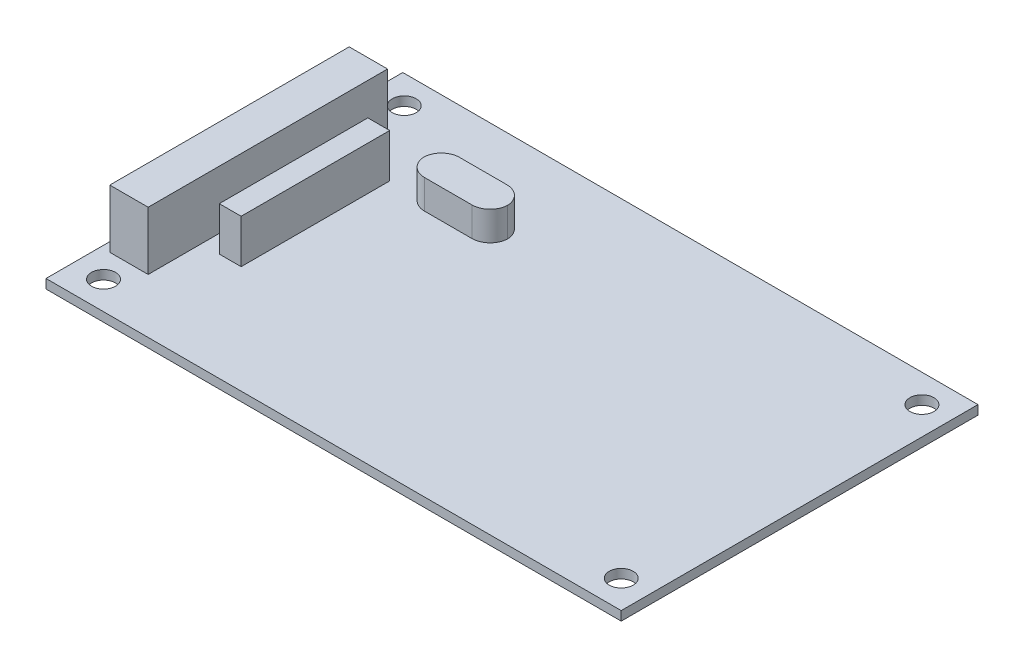
ISO-10303-21;
HEADER;
FILE_DESCRIPTION(('STEP AP214'),'2;1');
FILE_NAME('part.step','',(''),(''),'','','');
FILE_SCHEMA(('AUTOMOTIVE_DESIGN { 1 0 10303 214 1 1 1 1 }'));
ENDSEC;
DATA;
#1=APPLICATION_CONTEXT('core data for automotive mechanical design processes');
#2=APPLICATION_PROTOCOL_DEFINITION('international standard','automotive_design',2000,#1);
#3=PRODUCT_CONTEXT('',#1,'mechanical');
#4=PRODUCT('Part','Part','',(#3));
#5=PRODUCT_RELATED_PRODUCT_CATEGORY('part','',(#4));
#6=PRODUCT_DEFINITION_FORMATION('','',#4);
#7=PRODUCT_DEFINITION_CONTEXT('part definition',#1,'design');
#8=PRODUCT_DEFINITION('design','',#6,#7);
#9=PRODUCT_DEFINITION_SHAPE('','',#8);
#10=(LENGTH_UNIT() NAMED_UNIT(*) SI_UNIT(.MILLI.,.METRE.));
#11=(NAMED_UNIT(*) PLANE_ANGLE_UNIT() SI_UNIT($,.RADIAN.));
#12=(NAMED_UNIT(*) SI_UNIT($,.STERADIAN.) SOLID_ANGLE_UNIT());
#13=UNCERTAINTY_MEASURE_WITH_UNIT(LENGTH_MEASURE(1.E-05),#10,'distance_accuracy_value','');
#14=(GEOMETRIC_REPRESENTATION_CONTEXT(3) GLOBAL_UNCERTAINTY_ASSIGNED_CONTEXT((#13)) GLOBAL_UNIT_ASSIGNED_CONTEXT((#10,
#11,#12)) REPRESENTATION_CONTEXT('',''));
#15=CARTESIAN_POINT('',(0.,0.,0.));
#16=DIRECTION('',(0.,0.,1.));
#17=DIRECTION('',(1.,0.,0.));
#18=AXIS2_PLACEMENT_3D('',#15,#16,#17);
#19=CARTESIAN_POINT('',(0.,1.26,0.));
#20=DIRECTION('',(0.,1.,0.));
#21=DIRECTION('',(0.,0.,1.));
#22=AXIS2_PLACEMENT_3D('',#19,#20,#21);
#23=PLANE('',#22);
#24=CARTESIAN_POINT('',(-37.5265164262649,1.26,-12.719758394828));
#25=DIRECTION('',(0.,1.,0.));
#26=DIRECTION('',(0.,0.,1.));
#27=AXIS2_PLACEMENT_3D('',#24,#25,#26);
#28=CIRCLE('',#27,1.65);
#29=CARTESIAN_POINT('',(-37.5265164262649,1.26,-11.069758394828));
#30=VERTEX_POINT('',#29);
#31=EDGE_CURVE('E219',#30,#30,#28,.T.);
#32=ORIENTED_EDGE('',*,*,#31,.F.);
#33=EDGE_LOOP('',(#32));
#34=FACE_BOUND('',#33,.T.);
#35=CARTESIAN_POINT('',(-37.5265164262649,1.26,28.580241605172));
#36=DIRECTION('',(0.,1.,0.));
#37=DIRECTION('',(0.,0.,1.));
#38=AXIS2_PLACEMENT_3D('',#35,#36,#37);
#39=CIRCLE('',#38,1.65);
#40=CARTESIAN_POINT('',(-37.5265164262649,1.26,30.230241605172));
#41=VERTEX_POINT('',#40);
#42=EDGE_CURVE('E223',#41,#41,#39,.T.);
#43=ORIENTED_EDGE('',*,*,#42,.F.);
#44=EDGE_LOOP('',(#43));
#45=FACE_BOUND('',#44,.T.);
#46=CARTESIAN_POINT('',(33.5734835737351,1.26,28.580241605172));
#47=DIRECTION('',(0.,1.,0.));
#48=DIRECTION('',(0.,0.,1.));
#49=AXIS2_PLACEMENT_3D('',#46,#47,#48);
#50=CIRCLE('',#49,1.65);
#51=CARTESIAN_POINT('',(33.5734835737351,1.26,30.230241605172));
#52=VERTEX_POINT('',#51);
#53=EDGE_CURVE('E229',#52,#52,#50,.T.);
#54=ORIENTED_EDGE('',*,*,#53,.F.);
#55=EDGE_LOOP('',(#54));
#56=FACE_BOUND('',#55,.T.);
#57=CARTESIAN_POINT('',(33.5734835737351,1.26,-12.719758394828));
#58=DIRECTION('',(0.,1.,0.));
#59=DIRECTION('',(0.,0.,1.));
#60=AXIS2_PLACEMENT_3D('',#57,#58,#59);
#61=CIRCLE('',#60,1.65);
#62=CARTESIAN_POINT('',(33.5734835737351,1.26,-11.069758394828));
#63=VERTEX_POINT('',#62);
#64=EDGE_CURVE('E235',#63,#63,#61,.T.);
#65=ORIENTED_EDGE('',*,*,#64,.F.);
#66=EDGE_LOOP('',(#65));
#67=FACE_BOUND('',#66,.T.);
#68=DIRECTION('',(0.,0.,1.));
#69=VECTOR('',#68,1.);
#70=CARTESIAN_POINT('',(-41.5765164262649,1.26,-16.569758394828));
#71=LINE('',#70,#69);
#72=CARTESIAN_POINT('',(-41.5765164262649,1.26,-16.569758394828));
#73=VERTEX_POINT('',#72);
#74=CARTESIAN_POINT('',(-41.5765164262649,1.26,32.430241605172));
#75=VERTEX_POINT('',#74);
#76=EDGE_CURVE('E244',#73,#75,#71,.T.);
#77=ORIENTED_EDGE('',*,*,#76,.T.);
#78=DIRECTION('',(1.,0.,0.));
#79=VECTOR('',#78,1.);
#80=CARTESIAN_POINT('',(-41.5765164262649,1.26,32.430241605172));
#81=LINE('',#80,#79);
#82=CARTESIAN_POINT('',(37.4234835737351,1.26,32.430241605172));
#83=VERTEX_POINT('',#82);
#84=EDGE_CURVE('E247',#75,#83,#81,.T.);
#85=ORIENTED_EDGE('',*,*,#84,.T.);
#86=DIRECTION('',(0.,0.,-1.));
#87=VECTOR('',#86,1.);
#88=CARTESIAN_POINT('',(37.4234835737351,1.26,-16.569758394828));
#89=LINE('',#88,#87);
#90=CARTESIAN_POINT('',(37.4234835737351,1.26,-16.569758394828));
#91=VERTEX_POINT('',#90);
#92=EDGE_CURVE('E250',#83,#91,#89,.T.);
#93=ORIENTED_EDGE('',*,*,#92,.T.);
#94=DIRECTION('',(-1.,0.,0.));
#95=VECTOR('',#94,1.);
#96=CARTESIAN_POINT('',(-41.5765164262649,1.26,-16.569758394828));
#97=LINE('',#96,#95);
#98=EDGE_CURVE('E252',#91,#73,#97,.T.);
#99=ORIENTED_EDGE('',*,*,#98,.T.);
#100=EDGE_LOOP('',(#77,#85,#93,#99));
#101=FACE_BOUND('',#100,.T.);
#102=DIRECTION('',(-1.,0.,0.));
#103=VECTOR('',#102,1.);
#104=CARTESIAN_POINT('',(-35.036516426265,1.26,-7.93975839482802));
#105=LINE('',#104,#103);
#106=CARTESIAN_POINT('',(-35.036516426265,1.26,-7.93975839482802));
#107=VERTEX_POINT('',#106);
#108=CARTESIAN_POINT('',(-40.3065164262649,1.26,-7.93975839482802));
#109=VERTEX_POINT('',#108);
#110=EDGE_CURVE('E188',#107,#109,#105,.T.);
#111=ORIENTED_EDGE('',*,*,#110,.F.);
#112=DIRECTION('',(0.,0.,-1.));
#113=VECTOR('',#112,1.);
#114=CARTESIAN_POINT('',(-35.036516426265,1.26,-7.93975839482802));
#115=LINE('',#114,#113);
#116=CARTESIAN_POINT('',(-35.0365164262649,1.26,24.940241605172));
#117=VERTEX_POINT('',#116);
#118=EDGE_CURVE('E185',#117,#107,#115,.T.);
#119=ORIENTED_EDGE('',*,*,#118,.F.);
#120=DIRECTION('',(1.,0.,0.));
#121=VECTOR('',#120,1.);
#122=CARTESIAN_POINT('',(-35.0365164262649,1.26,24.940241605172));
#123=LINE('',#122,#121);
#124=CARTESIAN_POINT('',(-40.3065164262649,1.26,24.940241605172));
#125=VERTEX_POINT('',#124);
#126=EDGE_CURVE('E198',#125,#117,#123,.T.);
#127=ORIENTED_EDGE('',*,*,#126,.F.);
#128=DIRECTION('',(0.,0.,1.));
#129=VECTOR('',#128,1.);
#130=CARTESIAN_POINT('',(-40.3065164262649,1.26,-7.93975839482802));
#131=LINE('',#130,#129);
#132=EDGE_CURVE('E206',#109,#125,#131,.T.);
#133=ORIENTED_EDGE('',*,*,#132,.F.);
#134=EDGE_LOOP('',(#111,#119,#127,#133));
#135=FACE_BOUND('',#134,.T.);
#136=DIRECTION('',(-1.,0.,0.));
#137=VECTOR('',#136,1.);
#138=CARTESIAN_POINT('',(-29.576516426265,1.26,-2.76975839482802));
#139=LINE('',#138,#137);
#140=CARTESIAN_POINT('',(-29.576516426265,1.26,-2.76975839482802));
#141=VERTEX_POINT('',#140);
#142=CARTESIAN_POINT('',(-32.5765164262649,1.26,-2.76975839482802));
#143=VERTEX_POINT('',#142);
#144=EDGE_CURVE('E329',#141,#143,#139,.T.);
#145=ORIENTED_EDGE('',*,*,#144,.F.);
#146=DIRECTION('',(0.,0.,-1.));
#147=VECTOR('',#146,1.);
#148=CARTESIAN_POINT('',(-29.5765164262649,1.26,17.630241605172));
#149=LINE('',#148,#147);
#150=CARTESIAN_POINT('',(-29.5765164262649,1.26,17.630241605172));
#151=VERTEX_POINT('',#150);
#152=EDGE_CURVE('E183',#151,#141,#149,.T.);
#153=ORIENTED_EDGE('',*,*,#152,.F.);
#154=DIRECTION('',(1.,0.,0.));
#155=VECTOR('',#154,1.);
#156=CARTESIAN_POINT('',(-29.5765164262649,1.26,17.630241605172));
#157=LINE('',#156,#155);
#158=CARTESIAN_POINT('',(-32.5765164262649,1.26,17.630241605172));
#159=VERTEX_POINT('',#158);
#160=EDGE_CURVE('E179',#159,#151,#157,.T.);
#161=ORIENTED_EDGE('',*,*,#160,.F.);
#162=DIRECTION('',(0.,0.,1.));
#163=VECTOR('',#162,1.);
#164=CARTESIAN_POINT('',(-32.5765164262649,1.26,17.630241605172));
#165=LINE('',#164,#163);
#166=EDGE_CURVE('E331',#143,#159,#165,.T.);
#167=ORIENTED_EDGE('',*,*,#166,.F.);
#168=EDGE_LOOP('',(#145,#153,#161,#167));
#169=FACE_BOUND('',#168,.T.);
#170=DIRECTION('',(-1.,0.,0.));
#171=VECTOR('',#170,1.);
#172=CARTESIAN_POINT('',(-14.5765164262649,1.26,-6.36975839482802));
#173=LINE('',#172,#171);
#174=CARTESIAN_POINT('',(-17.0765164262649,1.26,-6.36975839482802));
#175=VERTEX_POINT('',#174);
#176=CARTESIAN_POINT('',(-23.5765164262649,1.26,-6.36975839482802));
#177=VERTEX_POINT('',#176);
#178=EDGE_CURVE('E296',#175,#177,#173,.T.);
#179=ORIENTED_EDGE('',*,*,#178,.F.);
#180=CARTESIAN_POINT('',(-17.0765164262649,1.26,-3.86975839482802));
#181=DIRECTION('',(0.,1.,0.));
#182=DIRECTION('',(0.,0.,1.));
#183=AXIS2_PLACEMENT_3D('',#180,#181,#182);
#184=CIRCLE('',#183,2.5);
#185=CARTESIAN_POINT('',(-14.5785172269056,1.26,-3.96975839482802));
#186=VERTEX_POINT('',#185);
#187=EDGE_CURVE('E11',#175,#186,#184,.F.);
#188=ORIENTED_EDGE('',*,*,#187,.T.);
#189=CARTESIAN_POINT('',(-17.0765164262649,1.26,-4.06975839482802));
#190=DIRECTION('',(0.,1.,0.));
#191=DIRECTION('',(0.,0.,1.));
#192=AXIS2_PLACEMENT_3D('',#189,#190,#191);
#193=CIRCLE('',#192,2.5);
#194=CARTESIAN_POINT('',(-17.0765164262649,1.26,-1.56975839482802));
#195=VERTEX_POINT('',#194);
#196=EDGE_CURVE('E43',#186,#195,#193,.F.);
#197=ORIENTED_EDGE('',*,*,#196,.T.);
#198=DIRECTION('',(1.,0.,0.));
#199=VECTOR('',#198,1.);
#200=CARTESIAN_POINT('',(-14.5765164262649,1.26,-1.56975839482802));
#201=LINE('',#200,#199);
#202=CARTESIAN_POINT('',(-23.5765164262649,1.26,-1.56975839482802));
#203=VERTEX_POINT('',#202);
#204=EDGE_CURVE('E300',#203,#195,#201,.T.);
#205=ORIENTED_EDGE('',*,*,#204,.F.);
#206=CARTESIAN_POINT('',(-23.5765164262649,1.26,-4.06975839482802));
#207=DIRECTION('',(0.,1.,0.));
#208=DIRECTION('',(0.,0.,1.));
#209=AXIS2_PLACEMENT_3D('',#206,#207,#208);
#210=CIRCLE('',#209,2.5);
#211=CARTESIAN_POINT('',(-26.0745156256243,1.26,-3.96975839482802));
#212=VERTEX_POINT('',#211);
#213=EDGE_CURVE('E56',#203,#212,#210,.F.);
#214=ORIENTED_EDGE('',*,*,#213,.T.);
#215=CARTESIAN_POINT('',(-23.5765164262649,1.26,-3.86975839482802));
#216=DIRECTION('',(0.,1.,0.));
#217=DIRECTION('',(0.,0.,1.));
#218=AXIS2_PLACEMENT_3D('',#215,#216,#217);
#219=CIRCLE('',#218,2.5);
#220=EDGE_CURVE('E291',#212,#177,#219,.F.);
#221=ORIENTED_EDGE('',*,*,#220,.T.);
#222=EDGE_LOOP('',(#179,#188,#197,#205,#214,#221));
#223=FACE_BOUND('',#222,.T.);
#224=ADVANCED_FACE('F34',(#34,#45,#56,#67,#101,#135,#169,#223),#23,.T.);
#225=CARTESIAN_POINT('',(-41.5765164262649,1.26,-16.569758394828));
#226=DIRECTION('',(1.,0.,0.));
#227=DIRECTION('',(0.,0.,-1.));
#228=AXIS2_PLACEMENT_3D('',#225,#226,#227);
#229=PLANE('',#228);
#230=DIRECTION('',(0.,0.,1.));
#231=VECTOR('',#230,1.);
#232=CARTESIAN_POINT('',(-41.5765164262649,0.,-16.569758394828));
#233=LINE('',#232,#231);
#234=CARTESIAN_POINT('',(-41.5765164262649,0.,-16.569758394828));
#235=VERTEX_POINT('',#234);
#236=CARTESIAN_POINT('',(-41.5765164262649,0.,32.430241605172));
#237=VERTEX_POINT('',#236);
#238=EDGE_CURVE('E241',#235,#237,#233,.T.);
#239=ORIENTED_EDGE('',*,*,#238,.T.);
#240=DIRECTION('',(0.,-1.,0.));
#241=VECTOR('',#240,1.);
#242=CARTESIAN_POINT('',(-41.5765164262649,1.26,32.430241605172));
#243=LINE('',#242,#241);
#244=EDGE_CURVE('E270',#75,#237,#243,.T.);
#245=ORIENTED_EDGE('',*,*,#244,.F.);
#246=ORIENTED_EDGE('',*,*,#76,.F.);
#247=DIRECTION('',(0.,-1.,0.));
#248=VECTOR('',#247,1.);
#249=CARTESIAN_POINT('',(-41.5765164262649,1.26,-16.569758394828));
#250=LINE('',#249,#248);
#251=EDGE_CURVE('E254',#73,#235,#250,.T.);
#252=ORIENTED_EDGE('',*,*,#251,.T.);
#253=EDGE_LOOP('',(#239,#245,#246,#252));
#254=FACE_BOUND('',#253,.T.);
#255=ADVANCED_FACE('F344',(#254),#229,.F.);
#256=CARTESIAN_POINT('',(-41.5765164262649,1.26,32.430241605172));
#257=DIRECTION('',(0.,0.,-1.));
#258=DIRECTION('',(-1.,0.,0.));
#259=AXIS2_PLACEMENT_3D('',#256,#257,#258);
#260=PLANE('',#259);
#261=DIRECTION('',(1.,0.,0.));
#262=VECTOR('',#261,1.);
#263=CARTESIAN_POINT('',(-41.5765164262649,0.,32.430241605172));
#264=LINE('',#263,#262);
#265=CARTESIAN_POINT('',(37.4234835737351,0.,32.430241605172));
#266=VERTEX_POINT('',#265);
#267=EDGE_CURVE('E257',#237,#266,#264,.T.);
#268=ORIENTED_EDGE('',*,*,#267,.T.);
#269=DIRECTION('',(0.,-1.,0.));
#270=VECTOR('',#269,1.);
#271=CARTESIAN_POINT('',(37.4234835737351,1.26,32.430241605172));
#272=LINE('',#271,#270);
#273=EDGE_CURVE('E267',#83,#266,#272,.T.);
#274=ORIENTED_EDGE('',*,*,#273,.F.);
#275=ORIENTED_EDGE('',*,*,#84,.F.);
#276=ORIENTED_EDGE('',*,*,#244,.T.);
#277=EDGE_LOOP('',(#268,#274,#275,#276));
#278=FACE_BOUND('',#277,.T.);
#279=ADVANCED_FACE('F421',(#278),#260,.F.);
#280=CARTESIAN_POINT('',(37.4234835737351,1.26,-16.569758394828));
#281=DIRECTION('',(-1.,0.,0.));
#282=DIRECTION('',(0.,0.,1.));
#283=AXIS2_PLACEMENT_3D('',#280,#281,#282);
#284=PLANE('',#283);
#285=DIRECTION('',(0.,0.,-1.));
#286=VECTOR('',#285,1.);
#287=CARTESIAN_POINT('',(37.4234835737351,0.,-16.569758394828));
#288=LINE('',#287,#286);
#289=CARTESIAN_POINT('',(37.4234835737351,0.,-16.569758394828));
#290=VERTEX_POINT('',#289);
#291=EDGE_CURVE('E259',#266,#290,#288,.T.);
#292=ORIENTED_EDGE('',*,*,#291,.T.);
#293=DIRECTION('',(0.,-1.,0.));
#294=VECTOR('',#293,1.);
#295=CARTESIAN_POINT('',(37.4234835737351,1.26,-16.569758394828));
#296=LINE('',#295,#294);
#297=EDGE_CURVE('E264',#91,#290,#296,.T.);
#298=ORIENTED_EDGE('',*,*,#297,.F.);
#299=ORIENTED_EDGE('',*,*,#92,.F.);
#300=ORIENTED_EDGE('',*,*,#273,.T.);
#301=EDGE_LOOP('',(#292,#298,#299,#300));
#302=FACE_BOUND('',#301,.T.);
#303=ADVANCED_FACE('F417',(#302),#284,.F.);
#304=CARTESIAN_POINT('',(-41.5765164262649,1.26,-16.569758394828));
#305=DIRECTION('',(0.,0.,1.));
#306=DIRECTION('',(1.,0.,0.));
#307=AXIS2_PLACEMENT_3D('',#304,#305,#306);
#308=PLANE('',#307);
#309=DIRECTION('',(-1.,0.,0.));
#310=VECTOR('',#309,1.);
#311=CARTESIAN_POINT('',(-41.5765164262649,0.,-16.569758394828));
#312=LINE('',#311,#310);
#313=EDGE_CURVE('E248',#290,#235,#312,.T.);
#314=ORIENTED_EDGE('',*,*,#313,.T.);
#315=ORIENTED_EDGE('',*,*,#251,.F.);
#316=ORIENTED_EDGE('',*,*,#98,.F.);
#317=ORIENTED_EDGE('',*,*,#297,.T.);
#318=EDGE_LOOP('',(#314,#315,#316,#317));
#319=FACE_BOUND('',#318,.T.);
#320=ADVANCED_FACE('F413',(#319),#308,.F.);
#321=CARTESIAN_POINT('',(0.,0.,0.));
#322=DIRECTION('',(0.,1.,0.));
#323=DIRECTION('',(0.,0.,1.));
#324=AXIS2_PLACEMENT_3D('',#321,#322,#323);
#325=PLANE('',#324);
#326=CARTESIAN_POINT('',(-37.5265164262649,0.,-12.719758394828));
#327=DIRECTION('',(0.,1.,0.));
#328=DIRECTION('',(0.,0.,1.));
#329=AXIS2_PLACEMENT_3D('',#326,#327,#328);
#330=CIRCLE('',#329,1.65);
#331=CARTESIAN_POINT('',(-37.5265164262649,0.,-11.069758394828));
#332=VERTEX_POINT('',#331);
#333=EDGE_CURVE('E220',#332,#332,#330,.T.);
#334=ORIENTED_EDGE('',*,*,#333,.T.);
#335=EDGE_LOOP('',(#334));
#336=FACE_BOUND('',#335,.T.);
#337=CARTESIAN_POINT('',(-37.5265164262649,0.,28.580241605172));
#338=DIRECTION('',(0.,1.,0.));
#339=DIRECTION('',(0.,0.,1.));
#340=AXIS2_PLACEMENT_3D('',#337,#338,#339);
#341=CIRCLE('',#340,1.65);
#342=CARTESIAN_POINT('',(-37.5265164262649,0.,30.230241605172));
#343=VERTEX_POINT('',#342);
#344=EDGE_CURVE('E226',#343,#343,#341,.T.);
#345=ORIENTED_EDGE('',*,*,#344,.T.);
#346=EDGE_LOOP('',(#345));
#347=FACE_BOUND('',#346,.T.);
#348=CARTESIAN_POINT('',(33.5734835737351,0.,28.580241605172));
#349=DIRECTION('',(0.,1.,0.));
#350=DIRECTION('',(0.,0.,1.));
#351=AXIS2_PLACEMENT_3D('',#348,#349,#350);
#352=CIRCLE('',#351,1.65);
#353=CARTESIAN_POINT('',(33.5734835737351,0.,30.230241605172));
#354=VERTEX_POINT('',#353);
#355=EDGE_CURVE('E232',#354,#354,#352,.T.);
#356=ORIENTED_EDGE('',*,*,#355,.T.);
#357=EDGE_LOOP('',(#356));
#358=FACE_BOUND('',#357,.T.);
#359=CARTESIAN_POINT('',(33.5734835737351,0.,-12.719758394828));
#360=DIRECTION('',(0.,1.,0.));
#361=DIRECTION('',(0.,0.,1.));
#362=AXIS2_PLACEMENT_3D('',#359,#360,#361);
#363=CIRCLE('',#362,1.65);
#364=CARTESIAN_POINT('',(33.5734835737351,0.,-11.069758394828));
#365=VERTEX_POINT('',#364);
#366=EDGE_CURVE('E238',#365,#365,#363,.T.);
#367=ORIENTED_EDGE('',*,*,#366,.T.);
#368=EDGE_LOOP('',(#367));
#369=FACE_BOUND('',#368,.T.);
#370=ORIENTED_EDGE('',*,*,#238,.F.);
#371=ORIENTED_EDGE('',*,*,#313,.F.);
#372=ORIENTED_EDGE('',*,*,#291,.F.);
#373=ORIENTED_EDGE('',*,*,#267,.F.);
#374=EDGE_LOOP('',(#370,#371,#372,#373));
#375=FACE_BOUND('',#374,.T.);
#376=ADVANCED_FACE('F408',(#336,#347,#358,#369,#375),#325,.F.);
#377=CARTESIAN_POINT('',(33.5734835737351,0.,-12.719758394828));
#378=DIRECTION('',(0.,1.,0.));
#379=DIRECTION('',(0.,0.,1.));
#380=AXIS2_PLACEMENT_3D('',#377,#378,#379);
#381=CYLINDRICAL_SURFACE('',#380,1.65);
#382=ORIENTED_EDGE('',*,*,#366,.F.);
#383=EDGE_LOOP('',(#382));
#384=FACE_BOUND('',#383,.T.);
#385=ORIENTED_EDGE('',*,*,#64,.T.);
#386=EDGE_LOOP('',(#385));
#387=FACE_BOUND('',#386,.T.);
#388=ADVANCED_FACE('F405',(#384,#387),#381,.F.);
#389=CARTESIAN_POINT('',(33.5734835737351,0.,28.580241605172));
#390=DIRECTION('',(0.,1.,0.));
#391=DIRECTION('',(0.,0.,1.));
#392=AXIS2_PLACEMENT_3D('',#389,#390,#391);
#393=CYLINDRICAL_SURFACE('',#392,1.65);
#394=ORIENTED_EDGE('',*,*,#355,.F.);
#395=EDGE_LOOP('',(#394));
#396=FACE_BOUND('',#395,.T.);
#397=ORIENTED_EDGE('',*,*,#53,.T.);
#398=EDGE_LOOP('',(#397));
#399=FACE_BOUND('',#398,.T.);
#400=ADVANCED_FACE('F401',(#396,#399),#393,.F.);
#401=CARTESIAN_POINT('',(-37.5265164262649,0.,28.580241605172));
#402=DIRECTION('',(0.,1.,0.));
#403=DIRECTION('',(0.,0.,1.));
#404=AXIS2_PLACEMENT_3D('',#401,#402,#403);
#405=CYLINDRICAL_SURFACE('',#404,1.65);
#406=ORIENTED_EDGE('',*,*,#344,.F.);
#407=EDGE_LOOP('',(#406));
#408=FACE_BOUND('',#407,.T.);
#409=ORIENTED_EDGE('',*,*,#42,.T.);
#410=EDGE_LOOP('',(#409));
#411=FACE_BOUND('',#410,.T.);
#412=ADVANCED_FACE('F397',(#408,#411),#405,.F.);
#413=CARTESIAN_POINT('',(-37.5265164262649,0.,-12.719758394828));
#414=DIRECTION('',(0.,1.,0.));
#415=DIRECTION('',(0.,0.,1.));
#416=AXIS2_PLACEMENT_3D('',#413,#414,#415);
#417=CYLINDRICAL_SURFACE('',#416,1.65);
#418=ORIENTED_EDGE('',*,*,#333,.F.);
#419=EDGE_LOOP('',(#418));
#420=FACE_BOUND('',#419,.T.);
#421=ORIENTED_EDGE('',*,*,#31,.T.);
#422=EDGE_LOOP('',(#421));
#423=FACE_BOUND('',#422,.T.);
#424=ADVANCED_FACE('F393',(#420,#423),#417,.F.);
#425=CARTESIAN_POINT('',(-35.036516426265,9.26,-7.93975839482802));
#426=DIRECTION('',(-1.,0.,0.));
#427=DIRECTION('',(0.,0.,1.));
#428=AXIS2_PLACEMENT_3D('',#425,#426,#427);
#429=PLANE('',#428);
#430=ORIENTED_EDGE('',*,*,#118,.T.);
#431=DIRECTION('',(0.,-1.,0.));
#432=VECTOR('',#431,1.);
#433=CARTESIAN_POINT('',(-35.036516426265,9.26,-7.93975839482802));
#434=LINE('',#433,#432);
#435=CARTESIAN_POINT('',(-35.036516426265,9.26,-7.93975839482802));
#436=VERTEX_POINT('',#435);
#437=EDGE_CURVE('E217',#436,#107,#434,.T.);
#438=ORIENTED_EDGE('',*,*,#437,.F.);
#439=DIRECTION('',(0.,0.,-1.));
#440=VECTOR('',#439,1.);
#441=CARTESIAN_POINT('',(-35.036516426265,9.26,-7.93975839482802));
#442=LINE('',#441,#440);
#443=CARTESIAN_POINT('',(-35.0365164262649,9.26,24.940241605172));
#444=VERTEX_POINT('',#443);
#445=EDGE_CURVE('E194',#444,#436,#442,.T.);
#446=ORIENTED_EDGE('',*,*,#445,.F.);
#447=DIRECTION('',(0.,-1.,0.));
#448=VECTOR('',#447,1.);
#449=CARTESIAN_POINT('',(-35.0365164262649,9.26,24.940241605172));
#450=LINE('',#449,#448);
#451=EDGE_CURVE('E203',#444,#117,#450,.T.);
#452=ORIENTED_EDGE('',*,*,#451,.T.);
#453=EDGE_LOOP('',(#430,#438,#446,#452));
#454=FACE_BOUND('',#453,.T.);
#455=ADVANCED_FACE('F389',(#454),#429,.F.);
#456=CARTESIAN_POINT('',(-35.036516426265,9.26,-7.93975839482802));
#457=DIRECTION('',(0.,0.,1.));
#458=DIRECTION('',(1.,0.,0.));
#459=AXIS2_PLACEMENT_3D('',#456,#457,#458);
#460=PLANE('',#459);
#461=ORIENTED_EDGE('',*,*,#110,.T.);
#462=DIRECTION('',(0.,-1.,0.));
#463=VECTOR('',#462,1.);
#464=CARTESIAN_POINT('',(-40.3065164262649,9.26,-7.93975839482802));
#465=LINE('',#464,#463);
#466=CARTESIAN_POINT('',(-40.3065164262649,9.26,-7.93975839482802));
#467=VERTEX_POINT('',#466);
#468=EDGE_CURVE('E214',#467,#109,#465,.T.);
#469=ORIENTED_EDGE('',*,*,#468,.F.);
#470=DIRECTION('',(-1.,0.,0.));
#471=VECTOR('',#470,1.);
#472=CARTESIAN_POINT('',(-35.036516426265,9.26,-7.93975839482802));
#473=LINE('',#472,#471);
#474=EDGE_CURVE('E197',#436,#467,#473,.T.);
#475=ORIENTED_EDGE('',*,*,#474,.F.);
#476=ORIENTED_EDGE('',*,*,#437,.T.);
#477=EDGE_LOOP('',(#461,#469,#475,#476));
#478=FACE_BOUND('',#477,.T.);
#479=ADVANCED_FACE('F385',(#478),#460,.F.);
#480=CARTESIAN_POINT('',(-40.3065164262649,9.26,-7.93975839482802));
#481=DIRECTION('',(1.,0.,0.));
#482=DIRECTION('',(0.,0.,-1.));
#483=AXIS2_PLACEMENT_3D('',#480,#481,#482);
#484=PLANE('',#483);
#485=ORIENTED_EDGE('',*,*,#132,.T.);
#486=DIRECTION('',(0.,-1.,0.));
#487=VECTOR('',#486,1.);
#488=CARTESIAN_POINT('',(-40.3065164262649,9.26,24.940241605172));
#489=LINE('',#488,#487);
#490=CARTESIAN_POINT('',(-40.3065164262649,9.26,24.940241605172));
#491=VERTEX_POINT('',#490);
#492=EDGE_CURVE('E212',#491,#125,#489,.T.);
#493=ORIENTED_EDGE('',*,*,#492,.F.);
#494=DIRECTION('',(0.,0.,1.));
#495=VECTOR('',#494,1.);
#496=CARTESIAN_POINT('',(-40.3065164262649,9.26,-7.93975839482802));
#497=LINE('',#496,#495);
#498=EDGE_CURVE('E200',#467,#491,#497,.T.);
#499=ORIENTED_EDGE('',*,*,#498,.F.);
#500=ORIENTED_EDGE('',*,*,#468,.T.);
#501=EDGE_LOOP('',(#485,#493,#499,#500));
#502=FACE_BOUND('',#501,.T.);
#503=ADVANCED_FACE('F381',(#502),#484,.F.);
#504=CARTESIAN_POINT('',(-35.0365164262649,9.26,24.940241605172));
#505=DIRECTION('',(0.,0.,-1.));
#506=DIRECTION('',(-1.,0.,0.));
#507=AXIS2_PLACEMENT_3D('',#504,#505,#506);
#508=PLANE('',#507);
#509=ORIENTED_EDGE('',*,*,#126,.T.);
#510=ORIENTED_EDGE('',*,*,#451,.F.);
#511=DIRECTION('',(1.,0.,0.));
#512=VECTOR('',#511,1.);
#513=CARTESIAN_POINT('',(-35.0365164262649,9.26,24.940241605172));
#514=LINE('',#513,#512);
#515=EDGE_CURVE('E202',#491,#444,#514,.T.);
#516=ORIENTED_EDGE('',*,*,#515,.F.);
#517=ORIENTED_EDGE('',*,*,#492,.T.);
#518=EDGE_LOOP('',(#509,#510,#516,#517));
#519=FACE_BOUND('',#518,.T.);
#520=ADVANCED_FACE('F377',(#519),#508,.F.);
#521=CARTESIAN_POINT('',(0.,9.26,0.));
#522=DIRECTION('',(0.,-1.,0.));
#523=DIRECTION('',(0.,0.,-1.));
#524=AXIS2_PLACEMENT_3D('',#521,#522,#523);
#525=PLANE('',#524);
#526=ORIENTED_EDGE('',*,*,#445,.T.);
#527=ORIENTED_EDGE('',*,*,#474,.T.);
#528=ORIENTED_EDGE('',*,*,#498,.T.);
#529=ORIENTED_EDGE('',*,*,#515,.T.);
#530=EDGE_LOOP('',(#526,#527,#528,#529));
#531=FACE_BOUND('',#530,.T.);
#532=ADVANCED_FACE('F374',(#531),#525,.F.);
#533=CARTESIAN_POINT('',(-29.5765164262649,7.26,17.630241605172));
#534=DIRECTION('',(-1.,0.,0.));
#535=DIRECTION('',(0.,0.,1.));
#536=AXIS2_PLACEMENT_3D('',#533,#534,#535);
#537=PLANE('',#536);
#538=ORIENTED_EDGE('',*,*,#152,.T.);
#539=DIRECTION('',(0.,-1.,0.));
#540=VECTOR('',#539,1.);
#541=CARTESIAN_POINT('',(-29.576516426265,7.26,-2.76975839482802));
#542=LINE('',#541,#540);
#543=CARTESIAN_POINT('',(-29.576516426265,7.26,-2.76975839482802));
#544=VERTEX_POINT('',#543);
#545=EDGE_CURVE('E163',#544,#141,#542,.T.);
#546=ORIENTED_EDGE('',*,*,#545,.F.);
#547=DIRECTION('',(0.,0.,-1.));
#548=VECTOR('',#547,1.);
#549=CARTESIAN_POINT('',(-29.5765164262649,7.26,17.630241605172));
#550=LINE('',#549,#548);
#551=CARTESIAN_POINT('',(-29.5765164262649,7.26,17.630241605172));
#552=VERTEX_POINT('',#551);
#553=EDGE_CURVE('E170',#552,#544,#550,.T.);
#554=ORIENTED_EDGE('',*,*,#553,.F.);
#555=DIRECTION('',(0.,-1.,0.));
#556=VECTOR('',#555,1.);
#557=CARTESIAN_POINT('',(-29.5765164262649,7.26,17.630241605172));
#558=LINE('',#557,#556);
#559=EDGE_CURVE('E327',#552,#151,#558,.T.);
#560=ORIENTED_EDGE('',*,*,#559,.T.);
#561=EDGE_LOOP('',(#538,#546,#554,#560));
#562=FACE_BOUND('',#561,.T.);
#563=ADVANCED_FACE('F181',(#562),#537,.F.);
#564=CARTESIAN_POINT('',(-29.576516426265,7.26,-2.76975839482802));
#565=DIRECTION('',(0.,0.,1.));
#566=DIRECTION('',(1.,0.,0.));
#567=AXIS2_PLACEMENT_3D('',#564,#565,#566);
#568=PLANE('',#567);
#569=ORIENTED_EDGE('',*,*,#144,.T.);
#570=DIRECTION('',(0.,-1.,0.));
#571=VECTOR('',#570,1.);
#572=CARTESIAN_POINT('',(-32.5765164262649,7.26,-2.76975839482802));
#573=LINE('',#572,#571);
#574=CARTESIAN_POINT('',(-32.5765164262649,7.26,-2.76975839482802));
#575=VERTEX_POINT('',#574);
#576=EDGE_CURVE('E166',#575,#143,#573,.T.);
#577=ORIENTED_EDGE('',*,*,#576,.F.);
#578=DIRECTION('',(-1.,0.,0.));
#579=VECTOR('',#578,1.);
#580=CARTESIAN_POINT('',(-29.576516426265,7.26,-2.76975839482802));
#581=LINE('',#580,#579);
#582=EDGE_CURVE('E159',#544,#575,#581,.T.);
#583=ORIENTED_EDGE('',*,*,#582,.F.);
#584=ORIENTED_EDGE('',*,*,#545,.T.);
#585=EDGE_LOOP('',(#569,#577,#583,#584));
#586=FACE_BOUND('',#585,.T.);
#587=ADVANCED_FACE('F161',(#586),#568,.F.);
#588=CARTESIAN_POINT('',(-32.5765164262649,7.26,17.630241605172));
#589=DIRECTION('',(1.,0.,0.));
#590=DIRECTION('',(0.,0.,-1.));
#591=AXIS2_PLACEMENT_3D('',#588,#589,#590);
#592=PLANE('',#591);
#593=ORIENTED_EDGE('',*,*,#166,.T.);
#594=DIRECTION('',(0.,-1.,0.));
#595=VECTOR('',#594,1.);
#596=CARTESIAN_POINT('',(-32.5765164262649,7.26,17.630241605172));
#597=LINE('',#596,#595);
#598=CARTESIAN_POINT('',(-32.5765164262649,7.26,17.630241605172));
#599=VERTEX_POINT('',#598);
#600=EDGE_CURVE('E190',#599,#159,#597,.T.);
#601=ORIENTED_EDGE('',*,*,#600,.F.);
#602=DIRECTION('',(0.,0.,1.));
#603=VECTOR('',#602,1.);
#604=CARTESIAN_POINT('',(-32.5765164262649,7.26,17.630241605172));
#605=LINE('',#604,#603);
#606=EDGE_CURVE('E169',#575,#599,#605,.T.);
#607=ORIENTED_EDGE('',*,*,#606,.F.);
#608=ORIENTED_EDGE('',*,*,#576,.T.);
#609=EDGE_LOOP('',(#593,#601,#607,#608));
#610=FACE_BOUND('',#609,.T.);
#611=ADVANCED_FACE('F341',(#610),#592,.F.);
#612=CARTESIAN_POINT('',(-29.5765164262649,7.26,17.630241605172));
#613=DIRECTION('',(0.,0.,-1.));
#614=DIRECTION('',(-1.,0.,0.));
#615=AXIS2_PLACEMENT_3D('',#612,#613,#614);
#616=PLANE('',#615);
#617=ORIENTED_EDGE('',*,*,#160,.T.);
#618=ORIENTED_EDGE('',*,*,#559,.F.);
#619=DIRECTION('',(1.,0.,0.));
#620=VECTOR('',#619,1.);
#621=CARTESIAN_POINT('',(-29.5765164262649,7.26,17.630241605172));
#622=LINE('',#621,#620);
#623=EDGE_CURVE('E175',#599,#552,#622,.T.);
#624=ORIENTED_EDGE('',*,*,#623,.F.);
#625=ORIENTED_EDGE('',*,*,#600,.T.);
#626=EDGE_LOOP('',(#617,#618,#624,#625));
#627=FACE_BOUND('',#626,.T.);
#628=ADVANCED_FACE('F337',(#627),#616,.F.);
#629=CARTESIAN_POINT('',(0.,7.26,0.));
#630=DIRECTION('',(0.,1.,0.));
#631=DIRECTION('',(0.,0.,1.));
#632=AXIS2_PLACEMENT_3D('',#629,#630,#631);
#633=PLANE('',#632);
#634=ORIENTED_EDGE('',*,*,#553,.T.);
#635=ORIENTED_EDGE('',*,*,#582,.T.);
#636=ORIENTED_EDGE('',*,*,#606,.T.);
#637=ORIENTED_EDGE('',*,*,#623,.T.);
#638=EDGE_LOOP('',(#634,#635,#636,#637));
#639=FACE_BOUND('',#638,.T.);
#640=ADVANCED_FACE('F173',(#639),#633,.T.);
#641=CARTESIAN_POINT('',(-14.5765164262649,5.26,-6.36975839482802));
#642=DIRECTION('',(0.,0.,1.));
#643=DIRECTION('',(1.,0.,0.));
#644=AXIS2_PLACEMENT_3D('',#641,#642,#643);
#645=PLANE('',#644);
#646=ORIENTED_EDGE('',*,*,#178,.T.);
#647=DIRECTION('',(0.,-1.,0.));
#648=VECTOR('',#647,1.);
#649=CARTESIAN_POINT('',(-23.5765164262649,5.26,-6.36975839482802));
#650=LINE('',#649,#648);
#651=CARTESIAN_POINT('',(-23.5765164262649,5.26,-6.36975839482802));
#652=VERTEX_POINT('',#651);
#653=EDGE_CURVE('E275',#177,#652,#650,.F.);
#654=ORIENTED_EDGE('',*,*,#653,.T.);
#655=DIRECTION('',(-1.,0.,0.));
#656=VECTOR('',#655,1.);
#657=CARTESIAN_POINT('',(-14.5765164262649,5.26,-6.36975839482802));
#658=LINE('',#657,#656);
#659=CARTESIAN_POINT('',(-17.0765164262649,5.26,-6.36975839482802));
#660=VERTEX_POINT('',#659);
#661=EDGE_CURVE('E314',#660,#652,#658,.T.);
#662=ORIENTED_EDGE('',*,*,#661,.F.);
#663=DIRECTION('',(0.,-1.,0.));
#664=VECTOR('',#663,1.);
#665=CARTESIAN_POINT('',(-17.0765164262649,5.26,-6.36975839482802));
#666=LINE('',#665,#664);
#667=EDGE_CURVE('E273',#660,#175,#666,.T.);
#668=ORIENTED_EDGE('',*,*,#667,.T.);
#669=EDGE_LOOP('',(#646,#654,#662,#668));
#670=FACE_BOUND('',#669,.T.);
#671=ADVANCED_FACE('F317',(#670),#645,.F.);
#672=CARTESIAN_POINT('',(-14.5765164262649,5.26,-1.56975839482802));
#673=DIRECTION('',(0.,0.,-1.));
#674=DIRECTION('',(-1.,0.,0.));
#675=AXIS2_PLACEMENT_3D('',#672,#673,#674);
#676=PLANE('',#675);
#677=DIRECTION('',(1.,0.,0.));
#678=VECTOR('',#677,1.);
#679=CARTESIAN_POINT('',(-14.5765164262649,5.26,-1.56975839482802));
#680=LINE('',#679,#678);
#681=CARTESIAN_POINT('',(-23.5765164262649,5.26,-1.56975839482802));
#682=VERTEX_POINT('',#681);
#683=CARTESIAN_POINT('',(-17.0765164262649,5.26,-1.56975839482802));
#684=VERTEX_POINT('',#683);
#685=EDGE_CURVE('E319',#682,#684,#680,.T.);
#686=ORIENTED_EDGE('',*,*,#685,.F.);
#687=DIRECTION('',(0.,-1.,0.));
#688=VECTOR('',#687,1.);
#689=CARTESIAN_POINT('',(-23.5765164262649,5.26,-1.56975839482802));
#690=LINE('',#689,#688);
#691=EDGE_CURVE('E289',#682,#203,#690,.T.);
#692=ORIENTED_EDGE('',*,*,#691,.T.);
#693=ORIENTED_EDGE('',*,*,#204,.T.);
#694=DIRECTION('',(0.,-1.,0.));
#695=VECTOR('',#694,1.);
#696=CARTESIAN_POINT('',(-17.0765164262649,5.26,-1.56975839482802));
#697=LINE('',#696,#695);
#698=EDGE_CURVE('E286',#195,#684,#697,.F.);
#699=ORIENTED_EDGE('',*,*,#698,.T.);
#700=EDGE_LOOP('',(#686,#692,#693,#699));
#701=FACE_BOUND('',#700,.T.);
#702=ADVANCED_FACE('F354',(#701),#676,.F.);
#703=CARTESIAN_POINT('',(0.,5.26,0.));
#704=DIRECTION('',(0.,-1.,0.));
#705=DIRECTION('',(0.,0.,-1.));
#706=AXIS2_PLACEMENT_3D('',#703,#704,#705);
#707=PLANE('',#706);
#708=ORIENTED_EDGE('',*,*,#661,.T.);
#709=CARTESIAN_POINT('',(-23.5765164262649,5.26,-3.86975839482802));
#710=DIRECTION('',(0.,-1.,0.));
#711=DIRECTION('',(0.,0.,-1.));
#712=AXIS2_PLACEMENT_3D('',#709,#710,#711);
#713=CIRCLE('',#712,2.5);
#714=CARTESIAN_POINT('',(-26.0745156256243,5.26,-3.96975839482802));
#715=VERTEX_POINT('',#714);
#716=EDGE_CURVE('E284',#652,#715,#713,.F.);
#717=ORIENTED_EDGE('',*,*,#716,.T.);
#718=CARTESIAN_POINT('',(-23.5765164262649,5.26,-4.06975839482802));
#719=DIRECTION('',(0.,-1.,0.));
#720=DIRECTION('',(0.,0.,-1.));
#721=AXIS2_PLACEMENT_3D('',#718,#719,#720);
#722=CIRCLE('',#721,2.5);
#723=EDGE_CURVE('E282',#715,#682,#722,.F.);
#724=ORIENTED_EDGE('',*,*,#723,.T.);
#725=ORIENTED_EDGE('',*,*,#685,.T.);
#726=CARTESIAN_POINT('',(-17.0765164262649,5.26,-4.06975839482802));
#727=DIRECTION('',(0.,-1.,0.));
#728=DIRECTION('',(0.,0.,-1.));
#729=AXIS2_PLACEMENT_3D('',#726,#727,#728);
#730=CIRCLE('',#729,2.5);
#731=CARTESIAN_POINT('',(-14.5785172269056,5.26,-3.96975839482802));
#732=VERTEX_POINT('',#731);
#733=EDGE_CURVE('E280',#684,#732,#730,.F.);
#734=ORIENTED_EDGE('',*,*,#733,.T.);
#735=CARTESIAN_POINT('',(-17.0765164262649,5.26,-3.86975839482802));
#736=DIRECTION('',(0.,-1.,0.));
#737=DIRECTION('',(0.,0.,-1.));
#738=AXIS2_PLACEMENT_3D('',#735,#736,#737);
#739=CIRCLE('',#738,2.5);
#740=EDGE_CURVE('E278',#732,#660,#739,.F.);
#741=ORIENTED_EDGE('',*,*,#740,.T.);
#742=EDGE_LOOP('',(#708,#717,#724,#725,#734,#741));
#743=FACE_BOUND('',#742,.T.);
#744=ADVANCED_FACE('F313',(#743),#707,.F.);
#745=CARTESIAN_POINT('',(-23.5765164262649,5.26,-4.06975839482802));
#746=DIRECTION('',(0.,-1.,0.));
#747=DIRECTION('',(0.,0.,-1.));
#748=AXIS2_PLACEMENT_3D('',#745,#746,#747);
#749=CYLINDRICAL_SURFACE('',#748,2.5);
#750=ORIENTED_EDGE('',*,*,#691,.F.);
#751=ORIENTED_EDGE('',*,*,#723,.F.);
#752=DIRECTION('',(0.,-1.,0.));
#753=VECTOR('',#752,1.);
#754=CARTESIAN_POINT('',(-26.0745156256243,3.26,-3.96975839482802));
#755=LINE('',#754,#753);
#756=EDGE_CURVE('E294',#212,#715,#755,.F.);
#757=ORIENTED_EDGE('',*,*,#756,.F.);
#758=ORIENTED_EDGE('',*,*,#213,.F.);
#759=EDGE_LOOP('',(#750,#751,#757,#758));
#760=FACE_BOUND('',#759,.T.);
#761=ADVANCED_FACE('F352',(#760),#749,.T.);
#762=CARTESIAN_POINT('',(-23.5765164262649,5.26,-3.86975839482802));
#763=DIRECTION('',(0.,-1.,0.));
#764=DIRECTION('',(0.,0.,-1.));
#765=AXIS2_PLACEMENT_3D('',#762,#763,#764);
#766=CYLINDRICAL_SURFACE('',#765,2.5);
#767=ORIENTED_EDGE('',*,*,#716,.F.);
#768=ORIENTED_EDGE('',*,*,#653,.F.);
#769=ORIENTED_EDGE('',*,*,#220,.F.);
#770=ORIENTED_EDGE('',*,*,#756,.T.);
#771=EDGE_LOOP('',(#767,#768,#769,#770));
#772=FACE_BOUND('',#771,.T.);
#773=ADVANCED_FACE('F347',(#772),#766,.T.);
#774=CARTESIAN_POINT('',(-17.0765164262649,5.26,-3.86975839482802));
#775=DIRECTION('',(0.,-1.,0.));
#776=DIRECTION('',(0.,0.,-1.));
#777=AXIS2_PLACEMENT_3D('',#774,#775,#776);
#778=CYLINDRICAL_SURFACE('',#777,2.5);
#779=ORIENTED_EDGE('',*,*,#667,.F.);
#780=ORIENTED_EDGE('',*,*,#740,.F.);
#781=DIRECTION('',(0.,-1.,0.));
#782=VECTOR('',#781,1.);
#783=CARTESIAN_POINT('',(-14.5785172269056,3.26,-3.96975839482802));
#784=LINE('',#783,#782);
#785=EDGE_CURVE('E38',#186,#732,#784,.F.);
#786=ORIENTED_EDGE('',*,*,#785,.F.);
#787=ORIENTED_EDGE('',*,*,#187,.F.);
#788=EDGE_LOOP('',(#779,#780,#786,#787));
#789=FACE_BOUND('',#788,.T.);
#790=ADVANCED_FACE('F36',(#789),#778,.T.);
#791=CARTESIAN_POINT('',(-17.0765164262649,5.26,-4.06975839482802));
#792=DIRECTION('',(0.,-1.,0.));
#793=DIRECTION('',(0.,0.,-1.));
#794=AXIS2_PLACEMENT_3D('',#791,#792,#793);
#795=CYLINDRICAL_SURFACE('',#794,2.5);
#796=ORIENTED_EDGE('',*,*,#733,.F.);
#797=ORIENTED_EDGE('',*,*,#698,.F.);
#798=ORIENTED_EDGE('',*,*,#196,.F.);
#799=ORIENTED_EDGE('',*,*,#785,.T.);
#800=EDGE_LOOP('',(#796,#797,#798,#799));
#801=FACE_BOUND('',#800,.T.);
#802=ADVANCED_FACE('F305',(#801),#795,.T.);
#803=CLOSED_SHELL('',(#224,#255,#279,#303,#320,#376,#388,#400,#412,#424,#455,#479,#503,#520,
#532,#563,#587,#611,#628,#640,#671,#702,#744,#761,#773,#790,#802));
#804=MANIFOLD_SOLID_BREP('B2',#803);
#805=ADVANCED_BREP_SHAPE_REPRESENTATION('',(#18,#804),#14);
#806=SHAPE_DEFINITION_REPRESENTATION(#9,#805);
ENDSEC;
END-ISO-10303-21;
